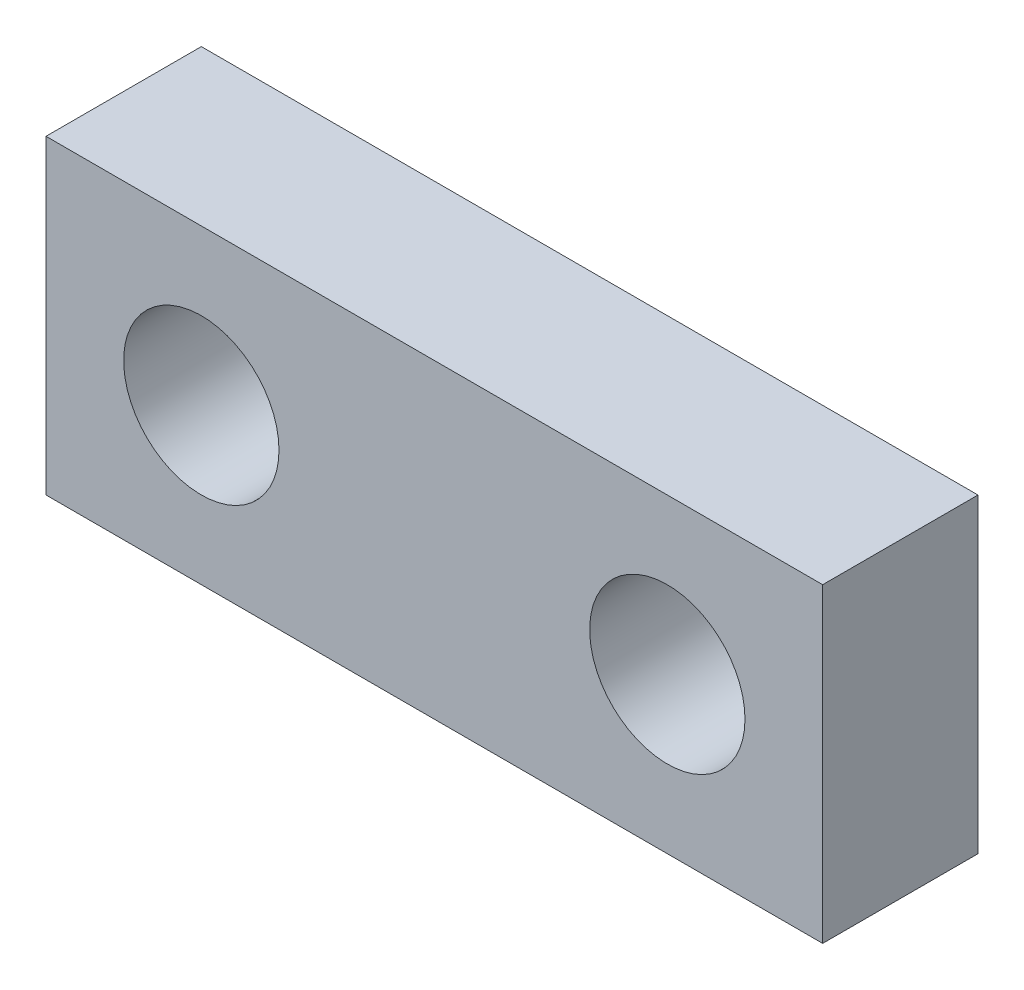
ISO-10303-21;
HEADER;
FILE_DESCRIPTION(('STEP AP214'),'2;1');
FILE_NAME('part.step','',(''),(''),'','','');
FILE_SCHEMA(('AUTOMOTIVE_DESIGN { 1 0 10303 214 1 1 1 1 }'));
ENDSEC;
DATA;
#1=APPLICATION_CONTEXT('core data for automotive mechanical design processes');
#2=APPLICATION_PROTOCOL_DEFINITION('international standard','automotive_design',2000,#1);
#3=PRODUCT_CONTEXT('',#1,'mechanical');
#4=PRODUCT('Part','Part','',(#3));
#5=PRODUCT_RELATED_PRODUCT_CATEGORY('part','',(#4));
#6=PRODUCT_DEFINITION_FORMATION('','',#4);
#7=PRODUCT_DEFINITION_CONTEXT('part definition',#1,'design');
#8=PRODUCT_DEFINITION('design','',#6,#7);
#9=PRODUCT_DEFINITION_SHAPE('','',#8);
#10=(LENGTH_UNIT() NAMED_UNIT(*) SI_UNIT(.MILLI.,.METRE.));
#11=(NAMED_UNIT(*) PLANE_ANGLE_UNIT() SI_UNIT($,.RADIAN.));
#12=(NAMED_UNIT(*) SI_UNIT($,.STERADIAN.) SOLID_ANGLE_UNIT());
#13=UNCERTAINTY_MEASURE_WITH_UNIT(LENGTH_MEASURE(1.E-05),#10,'distance_accuracy_value','');
#14=(GEOMETRIC_REPRESENTATION_CONTEXT(3) GLOBAL_UNCERTAINTY_ASSIGNED_CONTEXT((#13)) GLOBAL_UNIT_ASSIGNED_CONTEXT((#10,
#11,#12)) REPRESENTATION_CONTEXT('',''));
#15=CARTESIAN_POINT('',(0.,0.,0.));
#16=DIRECTION('',(0.,0.,1.));
#17=DIRECTION('',(1.,0.,0.));
#18=AXIS2_PLACEMENT_3D('',#15,#16,#17);
#19=CARTESIAN_POINT('',(0.,0.,5.));
#20=DIRECTION('',(0.,0.,1.));
#21=DIRECTION('',(1.,0.,0.));
#22=AXIS2_PLACEMENT_3D('',#19,#20,#21);
#23=PLANE('',#22);
#24=CARTESIAN_POINT('',(-20.,5.,5.));
#25=DIRECTION('',(0.,0.,1.));
#26=DIRECTION('',(1.,0.,0.));
#27=AXIS2_PLACEMENT_3D('',#24,#25,#26);
#28=CIRCLE('',#27,2.5);
#29=CARTESIAN_POINT('',(-17.5,5.,5.));
#30=VERTEX_POINT('',#29);
#31=EDGE_CURVE('E105',#30,#30,#28,.T.);
#32=ORIENTED_EDGE('',*,*,#31,.F.);
#33=EDGE_LOOP('',(#32));
#34=FACE_BOUND('',#33,.T.);
#35=DIRECTION('',(0.,1.,0.));
#36=VECTOR('',#35,1.);
#37=CARTESIAN_POINT('',(0.,0.,5.));
#38=LINE('',#37,#36);
#39=CARTESIAN_POINT('',(0.,0.,5.));
#40=VERTEX_POINT('',#39);
#41=CARTESIAN_POINT('',(0.,10.,5.));
#42=VERTEX_POINT('',#41);
#43=EDGE_CURVE('E90',#40,#42,#38,.T.);
#44=ORIENTED_EDGE('',*,*,#43,.T.);
#45=DIRECTION('',(-1.,0.,0.));
#46=VECTOR('',#45,1.);
#47=CARTESIAN_POINT('',(0.,10.,5.));
#48=LINE('',#47,#46);
#49=CARTESIAN_POINT('',(-25.,10.,5.));
#50=VERTEX_POINT('',#49);
#51=EDGE_CURVE('E85',#42,#50,#48,.T.);
#52=ORIENTED_EDGE('',*,*,#51,.T.);
#53=DIRECTION('',(0.,-1.,0.));
#54=VECTOR('',#53,1.);
#55=CARTESIAN_POINT('',(-25.,0.,5.));
#56=LINE('',#55,#54);
#57=CARTESIAN_POINT('',(-25.,0.,5.));
#58=VERTEX_POINT('',#57);
#59=EDGE_CURVE('E88',#50,#58,#56,.T.);
#60=ORIENTED_EDGE('',*,*,#59,.T.);
#61=DIRECTION('',(1.,0.,0.));
#62=VECTOR('',#61,1.);
#63=CARTESIAN_POINT('',(0.,0.,5.));
#64=LINE('',#63,#62);
#65=EDGE_CURVE('E55',#58,#40,#64,.T.);
#66=ORIENTED_EDGE('',*,*,#65,.T.);
#67=EDGE_LOOP('',(#44,#52,#60,#66));
#68=FACE_BOUND('',#67,.T.);
#69=CARTESIAN_POINT('',(-5.,5.,5.));
#70=DIRECTION('',(0.,0.,1.));
#71=DIRECTION('',(1.,0.,0.));
#72=AXIS2_PLACEMENT_3D('',#69,#70,#71);
#73=CIRCLE('',#72,2.5);
#74=CARTESIAN_POINT('',(-2.50000000000001,5.,5.));
#75=VERTEX_POINT('',#74);
#76=EDGE_CURVE('E120',#75,#75,#73,.T.);
#77=ORIENTED_EDGE('',*,*,#76,.F.);
#78=EDGE_LOOP('',(#77));
#79=FACE_BOUND('',#78,.T.);
#80=ADVANCED_FACE('F38',(#34,#68,#79),#23,.T.);
#81=CARTESIAN_POINT('',(0.,0.,0.));
#82=DIRECTION('',(0.,0.,1.));
#83=DIRECTION('',(1.,0.,0.));
#84=AXIS2_PLACEMENT_3D('',#81,#82,#83);
#85=PLANE('',#84);
#86=DIRECTION('',(0.,1.,0.));
#87=VECTOR('',#86,1.);
#88=CARTESIAN_POINT('',(0.,0.,0.));
#89=LINE('',#88,#87);
#90=CARTESIAN_POINT('',(0.,0.,0.));
#91=VERTEX_POINT('',#90);
#92=CARTESIAN_POINT('',(0.,10.,0.));
#93=VERTEX_POINT('',#92);
#94=EDGE_CURVE('E102',#91,#93,#89,.T.);
#95=ORIENTED_EDGE('',*,*,#94,.F.);
#96=DIRECTION('',(1.,0.,0.));
#97=VECTOR('',#96,1.);
#98=CARTESIAN_POINT('',(0.,0.,0.));
#99=LINE('',#98,#97);
#100=CARTESIAN_POINT('',(-25.,0.,0.));
#101=VERTEX_POINT('',#100);
#102=EDGE_CURVE('E78',#101,#91,#99,.T.);
#103=ORIENTED_EDGE('',*,*,#102,.F.);
#104=DIRECTION('',(0.,-1.,0.));
#105=VECTOR('',#104,1.);
#106=CARTESIAN_POINT('',(-25.,0.,0.));
#107=LINE('',#106,#105);
#108=CARTESIAN_POINT('',(-25.,10.,0.));
#109=VERTEX_POINT('',#108);
#110=EDGE_CURVE('E72',#109,#101,#107,.T.);
#111=ORIENTED_EDGE('',*,*,#110,.F.);
#112=DIRECTION('',(-1.,0.,0.));
#113=VECTOR('',#112,1.);
#114=CARTESIAN_POINT('',(0.,10.,0.));
#115=LINE('',#114,#113);
#116=EDGE_CURVE('E94',#93,#109,#115,.T.);
#117=ORIENTED_EDGE('',*,*,#116,.F.);
#118=EDGE_LOOP('',(#95,#103,#111,#117));
#119=FACE_BOUND('',#118,.T.);
#120=CARTESIAN_POINT('',(-20.,5.,0.));
#121=DIRECTION('',(0.,0.,1.));
#122=DIRECTION('',(1.,0.,0.));
#123=AXIS2_PLACEMENT_3D('',#120,#121,#122);
#124=CIRCLE('',#123,2.5);
#125=CARTESIAN_POINT('',(-17.5,5.,0.));
#126=VERTEX_POINT('',#125);
#127=EDGE_CURVE('E117',#126,#126,#124,.T.);
#128=ORIENTED_EDGE('',*,*,#127,.T.);
#129=EDGE_LOOP('',(#128));
#130=FACE_BOUND('',#129,.T.);
#131=CARTESIAN_POINT('',(-5.,5.,0.));
#132=DIRECTION('',(0.,0.,1.));
#133=DIRECTION('',(1.,0.,0.));
#134=AXIS2_PLACEMENT_3D('',#131,#132,#133);
#135=CIRCLE('',#134,2.5);
#136=CARTESIAN_POINT('',(-2.50000000000001,5.,0.));
#137=VERTEX_POINT('',#136);
#138=EDGE_CURVE('E123',#137,#137,#135,.T.);
#139=ORIENTED_EDGE('',*,*,#138,.T.);
#140=EDGE_LOOP('',(#139));
#141=FACE_BOUND('',#140,.T.);
#142=ADVANCED_FACE('F113',(#119,#130,#141),#85,.F.);
#143=CARTESIAN_POINT('',(0.,0.,5.));
#144=DIRECTION('',(-1.,0.,0.));
#145=DIRECTION('',(0.,-1.,0.));
#146=AXIS2_PLACEMENT_3D('',#143,#144,#145);
#147=PLANE('',#146);
#148=ORIENTED_EDGE('',*,*,#94,.T.);
#149=DIRECTION('',(0.,0.,-1.));
#150=VECTOR('',#149,1.);
#151=CARTESIAN_POINT('',(0.,10.,5.));
#152=LINE('',#151,#150);
#153=EDGE_CURVE('E11',#42,#93,#152,.T.);
#154=ORIENTED_EDGE('',*,*,#153,.F.);
#155=ORIENTED_EDGE('',*,*,#43,.F.);
#156=DIRECTION('',(0.,0.,-1.));
#157=VECTOR('',#156,1.);
#158=CARTESIAN_POINT('',(0.,0.,5.));
#159=LINE('',#158,#157);
#160=EDGE_CURVE('E98',#40,#91,#159,.T.);
#161=ORIENTED_EDGE('',*,*,#160,.T.);
#162=EDGE_LOOP('',(#148,#154,#155,#161));
#163=FACE_BOUND('',#162,.T.);
#164=ADVANCED_FACE('F40',(#163),#147,.F.);
#165=CARTESIAN_POINT('',(0.,10.,5.));
#166=DIRECTION('',(0.,-1.,0.));
#167=DIRECTION('',(1.,0.,0.));
#168=AXIS2_PLACEMENT_3D('',#165,#166,#167);
#169=PLANE('',#168);
#170=ORIENTED_EDGE('',*,*,#116,.T.);
#171=DIRECTION('',(0.,0.,-1.));
#172=VECTOR('',#171,1.);
#173=CARTESIAN_POINT('',(-25.,10.,5.));
#174=LINE('',#173,#172);
#175=EDGE_CURVE('E47',#50,#109,#174,.T.);
#176=ORIENTED_EDGE('',*,*,#175,.F.);
#177=ORIENTED_EDGE('',*,*,#51,.F.);
#178=ORIENTED_EDGE('',*,*,#153,.T.);
#179=EDGE_LOOP('',(#170,#176,#177,#178));
#180=FACE_BOUND('',#179,.T.);
#181=ADVANCED_FACE('F93',(#180),#169,.F.);
#182=CARTESIAN_POINT('',(-25.,0.,5.));
#183=DIRECTION('',(1.,0.,0.));
#184=DIRECTION('',(0.,0.,-1.));
#185=AXIS2_PLACEMENT_3D('',#182,#183,#184);
#186=PLANE('',#185);
#187=ORIENTED_EDGE('',*,*,#110,.T.);
#188=DIRECTION('',(0.,0.,-1.));
#189=VECTOR('',#188,1.);
#190=CARTESIAN_POINT('',(-25.,0.,5.));
#191=LINE('',#190,#189);
#192=EDGE_CURVE('E95',#58,#101,#191,.T.);
#193=ORIENTED_EDGE('',*,*,#192,.F.);
#194=ORIENTED_EDGE('',*,*,#59,.F.);
#195=ORIENTED_EDGE('',*,*,#175,.T.);
#196=EDGE_LOOP('',(#187,#193,#194,#195));
#197=FACE_BOUND('',#196,.T.);
#198=ADVANCED_FACE('F96',(#197),#186,.F.);
#199=CARTESIAN_POINT('',(0.,0.,5.));
#200=DIRECTION('',(0.,1.,0.));
#201=DIRECTION('',(-1.,0.,0.));
#202=AXIS2_PLACEMENT_3D('',#199,#200,#201);
#203=PLANE('',#202);
#204=ORIENTED_EDGE('',*,*,#102,.T.);
#205=ORIENTED_EDGE('',*,*,#160,.F.);
#206=ORIENTED_EDGE('',*,*,#65,.F.);
#207=ORIENTED_EDGE('',*,*,#192,.T.);
#208=EDGE_LOOP('',(#204,#205,#206,#207));
#209=FACE_BOUND('',#208,.T.);
#210=ADVANCED_FACE('F110',(#209),#203,.F.);
#211=CARTESIAN_POINT('',(-20.,5.,5.));
#212=DIRECTION('',(0.,0.,-1.));
#213=DIRECTION('',(-1.,0.,0.));
#214=AXIS2_PLACEMENT_3D('',#211,#212,#213);
#215=CYLINDRICAL_SURFACE('',#214,2.5);
#216=ORIENTED_EDGE('',*,*,#31,.T.);
#217=EDGE_LOOP('',(#216));
#218=FACE_BOUND('',#217,.T.);
#219=ORIENTED_EDGE('',*,*,#127,.F.);
#220=EDGE_LOOP('',(#219));
#221=FACE_BOUND('',#220,.T.);
#222=ADVANCED_FACE('F140',(#218,#221),#215,.F.);
#223=CARTESIAN_POINT('',(-5.,5.,5.));
#224=DIRECTION('',(0.,0.,-1.));
#225=DIRECTION('',(-1.,0.,0.));
#226=AXIS2_PLACEMENT_3D('',#223,#224,#225);
#227=CYLINDRICAL_SURFACE('',#226,2.5);
#228=ORIENTED_EDGE('',*,*,#76,.T.);
#229=EDGE_LOOP('',(#228));
#230=FACE_BOUND('',#229,.T.);
#231=ORIENTED_EDGE('',*,*,#138,.F.);
#232=EDGE_LOOP('',(#231));
#233=FACE_BOUND('',#232,.T.);
#234=ADVANCED_FACE('F129',(#230,#233),#227,.F.);
#235=CLOSED_SHELL('',(#80,#142,#164,#181,#198,#210,#222,#234));
#236=MANIFOLD_SOLID_BREP('B2',#235);
#237=ADVANCED_BREP_SHAPE_REPRESENTATION('',(#18,#236),#14);
#238=SHAPE_DEFINITION_REPRESENTATION(#9,#237);
ENDSEC;
END-ISO-10303-21;
